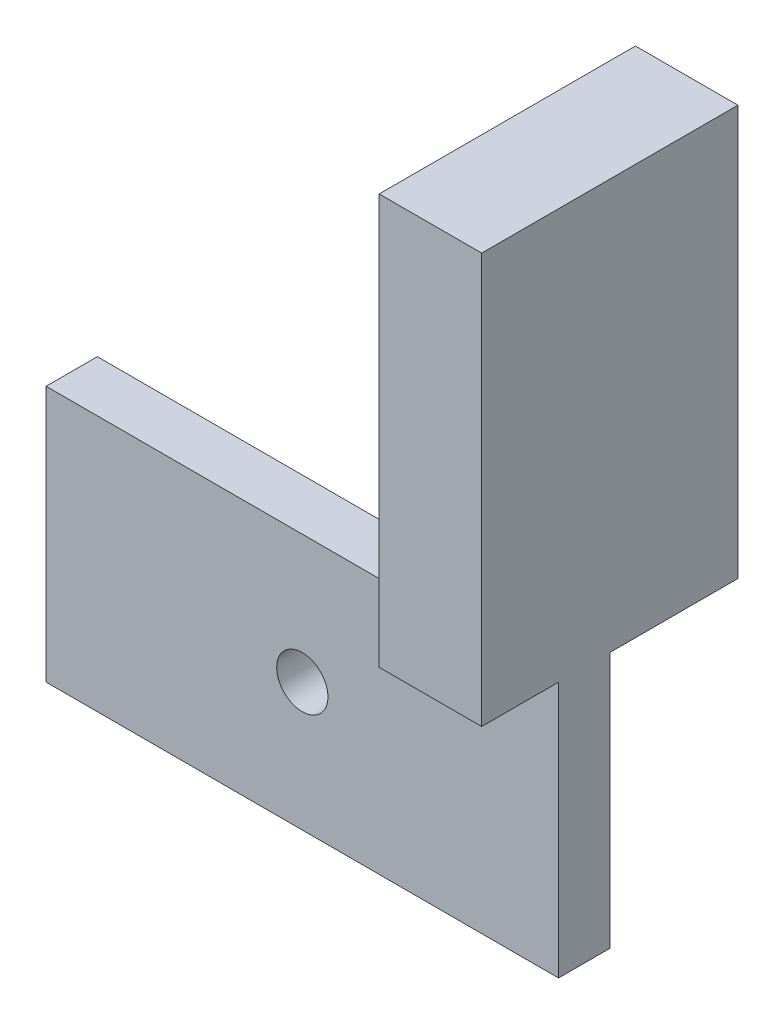
ISO-10303-21;
HEADER;
FILE_DESCRIPTION(('STEP AP214'),'2;1');
FILE_NAME('part.step','',(''),(''),'','','');
FILE_SCHEMA(('AUTOMOTIVE_DESIGN { 1 0 10303 214 1 1 1 1 }'));
ENDSEC;
DATA;
#1=APPLICATION_CONTEXT('core data for automotive mechanical design processes');
#2=APPLICATION_PROTOCOL_DEFINITION('international standard','automotive_design',2000,#1);
#3=PRODUCT_CONTEXT('',#1,'mechanical');
#4=PRODUCT('Part','Part','',(#3));
#5=PRODUCT_RELATED_PRODUCT_CATEGORY('part','',(#4));
#6=PRODUCT_DEFINITION_FORMATION('','',#4);
#7=PRODUCT_DEFINITION_CONTEXT('part definition',#1,'design');
#8=PRODUCT_DEFINITION('design','',#6,#7);
#9=PRODUCT_DEFINITION_SHAPE('','',#8);
#10=(LENGTH_UNIT() NAMED_UNIT(*) SI_UNIT(.MILLI.,.METRE.));
#11=(NAMED_UNIT(*) PLANE_ANGLE_UNIT() SI_UNIT($,.RADIAN.));
#12=(NAMED_UNIT(*) SI_UNIT($,.STERADIAN.) SOLID_ANGLE_UNIT());
#13=UNCERTAINTY_MEASURE_WITH_UNIT(LENGTH_MEASURE(1.E-05),#10,'distance_accuracy_value','');
#14=(GEOMETRIC_REPRESENTATION_CONTEXT(3) GLOBAL_UNCERTAINTY_ASSIGNED_CONTEXT((#13)) GLOBAL_UNIT_ASSIGNED_CONTEXT((#10,
#11,#12)) REPRESENTATION_CONTEXT('',''));
#15=CARTESIAN_POINT('',(0.,0.,0.));
#16=DIRECTION('',(0.,0.,1.));
#17=DIRECTION('',(1.,0.,0.));
#18=AXIS2_PLACEMENT_3D('',#15,#16,#17);
#19=CARTESIAN_POINT('',(-500.,250.,100.));
#20=DIRECTION('',(0.,-1.,0.));
#21=DIRECTION('',(0.,0.,-1.));
#22=AXIS2_PLACEMENT_3D('',#19,#20,#21);
#23=PLANE('',#22);
#24=DIRECTION('',(0.,0.,1.));
#25=VECTOR('',#24,1.);
#26=CARTESIAN_POINT('',(300.,250.,250.));
#27=LINE('',#26,#25);
#28=CARTESIAN_POINT('',(300.,250.,0.));
#29=VERTEX_POINT('',#28);
#30=CARTESIAN_POINT('',(300.,250.,100.));
#31=VERTEX_POINT('',#30);
#32=EDGE_CURVE('E11',#29,#31,#27,.T.);
#33=ORIENTED_EDGE('',*,*,#32,.F.);
#34=DIRECTION('',(-1.,0.,0.));
#35=VECTOR('',#34,1.);
#36=CARTESIAN_POINT('',(-500.,250.,0.));
#37=LINE('',#36,#35);
#38=CARTESIAN_POINT('',(-500.,250.,0.));
#39=VERTEX_POINT('',#38);
#40=EDGE_CURVE('E149',#29,#39,#37,.T.);
#41=ORIENTED_EDGE('',*,*,#40,.T.);
#42=DIRECTION('',(0.,0.,-1.));
#43=VECTOR('',#42,1.);
#44=CARTESIAN_POINT('',(-500.,250.,100.));
#45=LINE('',#44,#43);
#46=CARTESIAN_POINT('',(-500.,250.,100.));
#47=VERTEX_POINT('',#46);
#48=EDGE_CURVE('E45',#47,#39,#45,.T.);
#49=ORIENTED_EDGE('',*,*,#48,.F.);
#50=DIRECTION('',(-1.,0.,0.));
#51=VECTOR('',#50,1.);
#52=CARTESIAN_POINT('',(-500.,250.,100.));
#53=LINE('',#52,#51);
#54=EDGE_CURVE('E156',#31,#47,#53,.T.);
#55=ORIENTED_EDGE('',*,*,#54,.F.);
#56=EDGE_LOOP('',(#33,#41,#49,#55));
#57=FACE_BOUND('',#56,.T.);
#58=ADVANCED_FACE('F41',(#57),#23,.F.);
#59=CARTESIAN_POINT('',(500.,-250.,100.));
#60=DIRECTION('',(-1.,0.,0.));
#61=DIRECTION('',(0.,0.,1.));
#62=AXIS2_PLACEMENT_3D('',#59,#60,#61);
#63=PLANE('',#62);
#64=DIRECTION('',(0.,1.,0.));
#65=VECTOR('',#64,1.);
#66=CARTESIAN_POINT('',(500.,-250.,0.));
#67=LINE('',#66,#65);
#68=CARTESIAN_POINT('',(500.,-250.,0.));
#69=VERTEX_POINT('',#68);
#70=CARTESIAN_POINT('',(500.,250.,0.));
#71=VERTEX_POINT('',#70);
#72=EDGE_CURVE('E147',#69,#71,#67,.T.);
#73=ORIENTED_EDGE('',*,*,#72,.T.);
#74=DIRECTION('',(0.,0.,-1.));
#75=VECTOR('',#74,1.);
#76=CARTESIAN_POINT('',(500.,250.,250.));
#77=LINE('',#76,#75);
#78=CARTESIAN_POINT('',(500.,250.,-250.));
#79=VERTEX_POINT('',#78);
#80=EDGE_CURVE('E145',#71,#79,#77,.T.);
#81=ORIENTED_EDGE('',*,*,#80,.T.);
#82=DIRECTION('',(0.,-1.,0.));
#83=VECTOR('',#82,1.);
#84=CARTESIAN_POINT('',(500.,1050.,-250.));
#85=LINE('',#84,#83);
#86=CARTESIAN_POINT('',(500.,1050.,-250.));
#87=VERTEX_POINT('',#86);
#88=EDGE_CURVE('E126',#87,#79,#85,.T.);
#89=ORIENTED_EDGE('',*,*,#88,.F.);
#90=DIRECTION('',(0.,0.,-1.));
#91=VECTOR('',#90,1.);
#92=CARTESIAN_POINT('',(500.,1050.,250.));
#93=LINE('',#92,#91);
#94=CARTESIAN_POINT('',(500.,1050.,250.));
#95=VERTEX_POINT('',#94);
#96=EDGE_CURVE('E132',#95,#87,#93,.T.);
#97=ORIENTED_EDGE('',*,*,#96,.F.);
#98=DIRECTION('',(0.,-1.,0.));
#99=VECTOR('',#98,1.);
#100=CARTESIAN_POINT('',(500.,1050.,250.));
#101=LINE('',#100,#99);
#102=CARTESIAN_POINT('',(500.,250.,250.));
#103=VERTEX_POINT('',#102);
#104=EDGE_CURVE('E197',#95,#103,#101,.T.);
#105=ORIENTED_EDGE('',*,*,#104,.T.);
#106=CARTESIAN_POINT('',(500.,250.,100.));
#107=VERTEX_POINT('',#106);
#108=EDGE_CURVE('E185',#103,#107,#77,.T.);
#109=ORIENTED_EDGE('',*,*,#108,.T.);
#110=DIRECTION('',(0.,1.,0.));
#111=VECTOR('',#110,1.);
#112=CARTESIAN_POINT('',(500.,-250.,100.));
#113=LINE('',#112,#111);
#114=CARTESIAN_POINT('',(500.,-250.,100.));
#115=VERTEX_POINT('',#114);
#116=EDGE_CURVE('E91',#115,#107,#113,.T.);
#117=ORIENTED_EDGE('',*,*,#116,.F.);
#118=DIRECTION('',(0.,0.,-1.));
#119=VECTOR('',#118,1.);
#120=CARTESIAN_POINT('',(500.,-250.,100.));
#121=LINE('',#120,#119);
#122=EDGE_CURVE('E161',#115,#69,#121,.T.);
#123=ORIENTED_EDGE('',*,*,#122,.T.);
#124=EDGE_LOOP('',(#73,#81,#89,#97,#105,#109,#117,#123));
#125=FACE_BOUND('',#124,.T.);
#126=ADVANCED_FACE('F43',(#125),#63,.F.);
#127=CARTESIAN_POINT('',(-500.,-250.,100.));
#128=DIRECTION('',(1.,0.,0.));
#129=DIRECTION('',(0.,0.,-1.));
#130=AXIS2_PLACEMENT_3D('',#127,#128,#129);
#131=PLANE('',#130);
#132=DIRECTION('',(0.,-1.,0.));
#133=VECTOR('',#132,1.);
#134=CARTESIAN_POINT('',(-500.,-250.,0.));
#135=LINE('',#134,#133);
#136=CARTESIAN_POINT('',(-500.,-250.,0.));
#137=VERTEX_POINT('',#136);
#138=EDGE_CURVE('E166',#39,#137,#135,.T.);
#139=ORIENTED_EDGE('',*,*,#138,.T.);
#140=DIRECTION('',(0.,0.,-1.));
#141=VECTOR('',#140,1.);
#142=CARTESIAN_POINT('',(-500.,-250.,100.));
#143=LINE('',#142,#141);
#144=CARTESIAN_POINT('',(-500.,-250.,100.));
#145=VERTEX_POINT('',#144);
#146=EDGE_CURVE('E169',#145,#137,#143,.T.);
#147=ORIENTED_EDGE('',*,*,#146,.F.);
#148=DIRECTION('',(0.,-1.,0.));
#149=VECTOR('',#148,1.);
#150=CARTESIAN_POINT('',(-500.,-250.,100.));
#151=LINE('',#150,#149);
#152=EDGE_CURVE('E159',#47,#145,#151,.T.);
#153=ORIENTED_EDGE('',*,*,#152,.F.);
#154=ORIENTED_EDGE('',*,*,#48,.T.);
#155=EDGE_LOOP('',(#139,#147,#153,#154));
#156=FACE_BOUND('',#155,.T.);
#157=ADVANCED_FACE('F176',(#156),#131,.F.);
#158=CARTESIAN_POINT('',(-500.,-250.,100.));
#159=DIRECTION('',(0.,1.,0.));
#160=DIRECTION('',(0.,0.,1.));
#161=AXIS2_PLACEMENT_3D('',#158,#159,#160);
#162=PLANE('',#161);
#163=DIRECTION('',(1.,0.,0.));
#164=VECTOR('',#163,1.);
#165=CARTESIAN_POINT('',(-500.,-250.,0.));
#166=LINE('',#165,#164);
#167=EDGE_CURVE('E86',#137,#69,#166,.T.);
#168=ORIENTED_EDGE('',*,*,#167,.T.);
#169=ORIENTED_EDGE('',*,*,#122,.F.);
#170=DIRECTION('',(1.,0.,0.));
#171=VECTOR('',#170,1.);
#172=CARTESIAN_POINT('',(-500.,-250.,100.));
#173=LINE('',#172,#171);
#174=EDGE_CURVE('E66',#145,#115,#173,.T.);
#175=ORIENTED_EDGE('',*,*,#174,.F.);
#176=ORIENTED_EDGE('',*,*,#146,.T.);
#177=EDGE_LOOP('',(#168,#169,#175,#176));
#178=FACE_BOUND('',#177,.T.);
#179=ADVANCED_FACE('F217',(#178),#162,.F.);
#180=CARTESIAN_POINT('',(0.,0.,100.));
#181=DIRECTION('',(0.,0.,-1.));
#182=DIRECTION('',(-1.,0.,0.));
#183=AXIS2_PLACEMENT_3D('',#180,#181,#182);
#184=PLANE('',#183);
#185=CARTESIAN_POINT('',(0.,0.,100.));
#186=DIRECTION('',(0.,0.,-1.));
#187=DIRECTION('',(-1.,0.,0.));
#188=AXIS2_PLACEMENT_3D('',#185,#186,#187);
#189=CIRCLE('',#188,50.);
#190=CARTESIAN_POINT('',(-50.,0.,100.));
#191=VERTEX_POINT('',#190);
#192=EDGE_CURVE('E186',#191,#191,#189,.F.);
#193=ORIENTED_EDGE('',*,*,#192,.F.);
#194=EDGE_LOOP('',(#193));
#195=FACE_BOUND('',#194,.T.);
#196=ORIENTED_EDGE('',*,*,#116,.T.);
#197=EDGE_CURVE('E157',#107,#31,#53,.T.);
#198=ORIENTED_EDGE('',*,*,#197,.T.);
#199=ORIENTED_EDGE('',*,*,#54,.T.);
#200=ORIENTED_EDGE('',*,*,#152,.T.);
#201=ORIENTED_EDGE('',*,*,#174,.T.);
#202=EDGE_LOOP('',(#196,#198,#199,#200,#201));
#203=FACE_BOUND('',#202,.T.);
#204=ADVANCED_FACE('F208',(#195,#203),#184,.F.);
#205=CARTESIAN_POINT('',(0.,0.,0.));
#206=DIRECTION('',(0.,0.,-1.));
#207=DIRECTION('',(-1.,0.,0.));
#208=AXIS2_PLACEMENT_3D('',#205,#206,#207);
#209=PLANE('',#208);
#210=CARTESIAN_POINT('',(0.,0.,0.));
#211=DIRECTION('',(0.,0.,1.));
#212=DIRECTION('',(1.,0.,0.));
#213=AXIS2_PLACEMENT_3D('',#210,#211,#212);
#214=CIRCLE('',#213,50.);
#215=CARTESIAN_POINT('',(50.,0.,0.));
#216=VERTEX_POINT('',#215);
#217=EDGE_CURVE('E190',#216,#216,#214,.T.);
#218=ORIENTED_EDGE('',*,*,#217,.T.);
#219=EDGE_LOOP('',(#218));
#220=FACE_BOUND('',#219,.T.);
#221=ORIENTED_EDGE('',*,*,#72,.F.);
#222=ORIENTED_EDGE('',*,*,#167,.F.);
#223=ORIENTED_EDGE('',*,*,#138,.F.);
#224=ORIENTED_EDGE('',*,*,#40,.F.);
#225=EDGE_CURVE('E163',#71,#29,#37,.T.);
#226=ORIENTED_EDGE('',*,*,#225,.F.);
#227=EDGE_LOOP('',(#221,#222,#223,#224,#226));
#228=FACE_BOUND('',#227,.T.);
#229=ADVANCED_FACE('F179',(#220,#228),#209,.T.);
#230=CARTESIAN_POINT('',(0.,250.,0.));
#231=DIRECTION('',(0.,-1.,0.));
#232=DIRECTION('',(0.,0.,-1.));
#233=AXIS2_PLACEMENT_3D('',#230,#231,#232);
#234=PLANE('',#233);
#235=ORIENTED_EDGE('',*,*,#197,.F.);
#236=ORIENTED_EDGE('',*,*,#108,.F.);
#237=DIRECTION('',(1.,0.,0.));
#238=VECTOR('',#237,1.);
#239=CARTESIAN_POINT('',(300.,250.,250.));
#240=LINE('',#239,#238);
#241=CARTESIAN_POINT('',(300.,250.,250.));
#242=VERTEX_POINT('',#241);
#243=EDGE_CURVE('E141',#242,#103,#240,.T.);
#244=ORIENTED_EDGE('',*,*,#243,.F.);
#245=EDGE_CURVE('E52',#31,#242,#27,.T.);
#246=ORIENTED_EDGE('',*,*,#245,.F.);
#247=EDGE_LOOP('',(#235,#236,#244,#246));
#248=FACE_BOUND('',#247,.T.);
#249=ADVANCED_FACE('F207',(#248),#234,.T.);
#250=CARTESIAN_POINT('',(300.,1050.,-250.));
#251=DIRECTION('',(0.,0.,1.));
#252=DIRECTION('',(1.,0.,0.));
#253=AXIS2_PLACEMENT_3D('',#250,#251,#252);
#254=PLANE('',#253);
#255=DIRECTION('',(-1.,0.,0.));
#256=VECTOR('',#255,1.);
#257=CARTESIAN_POINT('',(300.,250.,-250.));
#258=LINE('',#257,#256);
#259=CARTESIAN_POINT('',(300.,250.,-250.));
#260=VERTEX_POINT('',#259);
#261=EDGE_CURVE('E184',#79,#260,#258,.T.);
#262=ORIENTED_EDGE('',*,*,#261,.T.);
#263=DIRECTION('',(0.,-1.,0.));
#264=VECTOR('',#263,1.);
#265=CARTESIAN_POINT('',(300.,1050.,-250.));
#266=LINE('',#265,#264);
#267=CARTESIAN_POINT('',(300.,1050.,-250.));
#268=VERTEX_POINT('',#267);
#269=EDGE_CURVE('E128',#268,#260,#266,.T.);
#270=ORIENTED_EDGE('',*,*,#269,.F.);
#271=DIRECTION('',(-1.,0.,0.));
#272=VECTOR('',#271,1.);
#273=CARTESIAN_POINT('',(300.,1050.,-250.));
#274=LINE('',#273,#272);
#275=EDGE_CURVE('E122',#87,#268,#274,.T.);
#276=ORIENTED_EDGE('',*,*,#275,.F.);
#277=ORIENTED_EDGE('',*,*,#88,.T.);
#278=EDGE_LOOP('',(#262,#270,#276,#277));
#279=FACE_BOUND('',#278,.T.);
#280=ADVANCED_FACE('F124',(#279),#254,.F.);
#281=CARTESIAN_POINT('',(300.,1050.,250.));
#282=DIRECTION('',(1.,0.,0.));
#283=DIRECTION('',(0.,0.,-1.));
#284=AXIS2_PLACEMENT_3D('',#281,#282,#283);
#285=PLANE('',#284);
#286=EDGE_CURVE('E51',#260,#29,#27,.T.);
#287=ORIENTED_EDGE('',*,*,#286,.T.);
#288=ORIENTED_EDGE('',*,*,#32,.T.);
#289=ORIENTED_EDGE('',*,*,#245,.T.);
#290=DIRECTION('',(0.,-1.,0.));
#291=VECTOR('',#290,1.);
#292=CARTESIAN_POINT('',(300.,1050.,250.));
#293=LINE('',#292,#291);
#294=CARTESIAN_POINT('',(300.,1050.,250.));
#295=VERTEX_POINT('',#294);
#296=EDGE_CURVE('E151',#295,#242,#293,.T.);
#297=ORIENTED_EDGE('',*,*,#296,.F.);
#298=DIRECTION('',(0.,0.,1.));
#299=VECTOR('',#298,1.);
#300=CARTESIAN_POINT('',(300.,1050.,250.));
#301=LINE('',#300,#299);
#302=EDGE_CURVE('E131',#268,#295,#301,.T.);
#303=ORIENTED_EDGE('',*,*,#302,.F.);
#304=ORIENTED_EDGE('',*,*,#269,.T.);
#305=EDGE_LOOP('',(#287,#288,#289,#297,#303,#304));
#306=FACE_BOUND('',#305,.T.);
#307=ADVANCED_FACE('F227',(#306),#285,.F.);
#308=CARTESIAN_POINT('',(300.,1050.,250.));
#309=DIRECTION('',(0.,0.,-1.));
#310=DIRECTION('',(-1.,0.,0.));
#311=AXIS2_PLACEMENT_3D('',#308,#309,#310);
#312=PLANE('',#311);
#313=ORIENTED_EDGE('',*,*,#243,.T.);
#314=ORIENTED_EDGE('',*,*,#104,.F.);
#315=DIRECTION('',(1.,0.,0.));
#316=VECTOR('',#315,1.);
#317=CARTESIAN_POINT('',(300.,1050.,250.));
#318=LINE('',#317,#316);
#319=EDGE_CURVE('E137',#295,#95,#318,.T.);
#320=ORIENTED_EDGE('',*,*,#319,.F.);
#321=ORIENTED_EDGE('',*,*,#296,.T.);
#322=EDGE_LOOP('',(#313,#314,#320,#321));
#323=FACE_BOUND('',#322,.T.);
#324=ADVANCED_FACE('F202',(#323),#312,.F.);
#325=CARTESIAN_POINT('',(0.,1050.,0.));
#326=DIRECTION('',(0.,-1.,0.));
#327=DIRECTION('',(0.,0.,-1.));
#328=AXIS2_PLACEMENT_3D('',#325,#326,#327);
#329=PLANE('',#328);
#330=ORIENTED_EDGE('',*,*,#96,.T.);
#331=ORIENTED_EDGE('',*,*,#275,.T.);
#332=ORIENTED_EDGE('',*,*,#302,.T.);
#333=ORIENTED_EDGE('',*,*,#319,.T.);
#334=EDGE_LOOP('',(#330,#331,#332,#333));
#335=FACE_BOUND('',#334,.T.);
#336=ADVANCED_FACE('F135',(#335),#329,.F.);
#337=ORIENTED_EDGE('',*,*,#80,.F.);
#338=ORIENTED_EDGE('',*,*,#225,.T.);
#339=ORIENTED_EDGE('',*,*,#286,.F.);
#340=ORIENTED_EDGE('',*,*,#261,.F.);
#341=EDGE_LOOP('',(#337,#338,#339,#340));
#342=FACE_BOUND('',#341,.T.);
#343=ADVANCED_FACE('F181',(#342),#234,.T.);
#344=CARTESIAN_POINT('',(0.,0.,250.));
#345=DIRECTION('',(0.,0.,-1.));
#346=DIRECTION('',(-1.,0.,0.));
#347=AXIS2_PLACEMENT_3D('',#344,#345,#346);
#348=CYLINDRICAL_SURFACE('',#347,50.);
#349=ORIENTED_EDGE('',*,*,#217,.F.);
#350=EDGE_LOOP('',(#349));
#351=FACE_BOUND('',#350,.T.);
#352=ORIENTED_EDGE('',*,*,#192,.T.);
#353=EDGE_LOOP('',(#352));
#354=FACE_BOUND('',#353,.T.);
#355=ADVANCED_FACE('F234',(#351,#354),#348,.F.);
#356=CLOSED_SHELL('',(#58,#126,#157,#179,#204,#229,#249,#280,#307,#324,#336,#343,#355));
#357=MANIFOLD_SOLID_BREP('B2',#356);
#358=ADVANCED_BREP_SHAPE_REPRESENTATION('',(#18,#357),#14);
#359=SHAPE_DEFINITION_REPRESENTATION(#9,#358);
ENDSEC;
END-ISO-10303-21;
